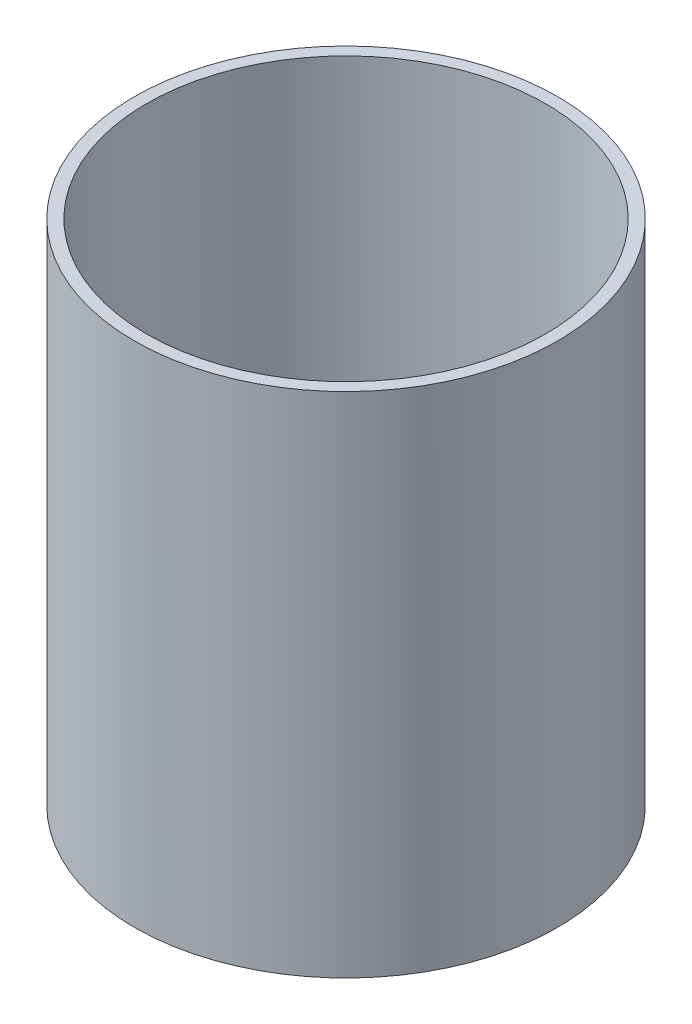
ISO-10303-21;
HEADER;
FILE_DESCRIPTION(('STEP AP214'),'2;1');
FILE_NAME('part.step','',(''),(''),'','','');
FILE_SCHEMA(('AUTOMOTIVE_DESIGN { 1 0 10303 214 1 1 1 1 }'));
ENDSEC;
DATA;
#1=APPLICATION_CONTEXT('core data for automotive mechanical design processes');
#2=APPLICATION_PROTOCOL_DEFINITION('international standard','automotive_design',2000,#1);
#3=PRODUCT_CONTEXT('',#1,'mechanical');
#4=PRODUCT('Part','Part','',(#3));
#5=PRODUCT_RELATED_PRODUCT_CATEGORY('part','',(#4));
#6=PRODUCT_DEFINITION_FORMATION('','',#4);
#7=PRODUCT_DEFINITION_CONTEXT('part definition',#1,'design');
#8=PRODUCT_DEFINITION('design','',#6,#7);
#9=PRODUCT_DEFINITION_SHAPE('','',#8);
#10=(LENGTH_UNIT() NAMED_UNIT(*) SI_UNIT(.MILLI.,.METRE.));
#11=(NAMED_UNIT(*) PLANE_ANGLE_UNIT() SI_UNIT($,.RADIAN.));
#12=(NAMED_UNIT(*) SI_UNIT($,.STERADIAN.) SOLID_ANGLE_UNIT());
#13=UNCERTAINTY_MEASURE_WITH_UNIT(LENGTH_MEASURE(1.E-05),#10,'distance_accuracy_value','');
#14=(GEOMETRIC_REPRESENTATION_CONTEXT(3) GLOBAL_UNCERTAINTY_ASSIGNED_CONTEXT((#13)) GLOBAL_UNIT_ASSIGNED_CONTEXT((#10,
#11,#12)) REPRESENTATION_CONTEXT('',''));
#15=CARTESIAN_POINT('',(0.,0.,0.));
#16=DIRECTION('',(0.,0.,1.));
#17=DIRECTION('',(1.,0.,0.));
#18=AXIS2_PLACEMENT_3D('',#15,#16,#17);
#19=CARTESIAN_POINT('',(0.,50.8,0.));
#20=DIRECTION('',(0.,-1.,0.));
#21=DIRECTION('',(0.,0.,-1.));
#22=AXIS2_PLACEMENT_3D('',#19,#20,#21);
#23=CYLINDRICAL_SURFACE('',#22,17.78);
#24=CARTESIAN_POINT('',(0.,50.8,0.));
#25=DIRECTION('',(0.,1.,0.));
#26=DIRECTION('',(0.,0.,1.));
#27=AXIS2_PLACEMENT_3D('',#24,#25,#26);
#28=CIRCLE('',#27,17.78);
#29=CARTESIAN_POINT('',(0.,50.8,17.78));
#30=VERTEX_POINT('',#29);
#31=EDGE_CURVE('E103',#30,#30,#28,.T.);
#32=ORIENTED_EDGE('',*,*,#31,.F.);
#33=EDGE_LOOP('',(#32));
#34=FACE_BOUND('',#33,.T.);
#35=DIRECTION('',(0.,-1.,0.));
#36=VECTOR('',#35,1.);
#37=CARTESIAN_POINT('',(-17.5976362048998,50.8,2.54));
#38=LINE('',#37,#36);
#39=CARTESIAN_POINT('',(-17.5976362048998,8.128,2.54));
#40=VERTEX_POINT('',#39);
#41=CARTESIAN_POINT('',(-17.5976362048998,0.,2.54));
#42=VERTEX_POINT('',#41);
#43=EDGE_CURVE('E83',#40,#42,#38,.T.);
#44=ORIENTED_EDGE('',*,*,#43,.F.);
#45=CARTESIAN_POINT('',(0.,8.128,0.));
#46=DIRECTION('',(0.,-1.,0.));
#47=DIRECTION('',(0.,0.,-1.));
#48=AXIS2_PLACEMENT_3D('',#45,#46,#47);
#49=CIRCLE('',#48,17.78);
#50=CARTESIAN_POINT('',(-17.5976362048998,8.128,-2.54));
#51=VERTEX_POINT('',#50);
#52=EDGE_CURVE('E118',#51,#40,#49,.T.);
#53=ORIENTED_EDGE('',*,*,#52,.F.);
#54=DIRECTION('',(0.,-1.,0.));
#55=VECTOR('',#54,1.);
#56=CARTESIAN_POINT('',(-17.5976362048998,50.8,-2.54));
#57=LINE('',#56,#55);
#58=CARTESIAN_POINT('',(-17.5976362048998,0.,-2.54));
#59=VERTEX_POINT('',#58);
#60=EDGE_CURVE('E106',#59,#51,#57,.F.);
#61=ORIENTED_EDGE('',*,*,#60,.F.);
#62=CARTESIAN_POINT('',(0.,0.,0.));
#63=DIRECTION('',(0.,1.,0.));
#64=DIRECTION('',(0.,0.,1.));
#65=AXIS2_PLACEMENT_3D('',#62,#63,#64);
#66=CIRCLE('',#65,17.78);
#67=EDGE_CURVE('E98',#59,#42,#66,.T.);
#68=ORIENTED_EDGE('',*,*,#67,.T.);
#69=EDGE_LOOP('',(#44,#53,#61,#68));
#70=FACE_BOUND('',#69,.T.);
#71=ADVANCED_FACE('F39',(#34,#70),#23,.T.);
#72=CARTESIAN_POINT('',(0.,-127.,0.));
#73=DIRECTION('',(0.,1.,0.));
#74=DIRECTION('',(0.,0.,1.));
#75=AXIS2_PLACEMENT_3D('',#72,#73,#74);
#76=CYLINDRICAL_SURFACE('',#75,16.764);
#77=CARTESIAN_POINT('',(0.,50.8,0.));
#78=DIRECTION('',(0.,1.,0.));
#79=DIRECTION('',(0.,0.,1.));
#80=AXIS2_PLACEMENT_3D('',#77,#78,#79);
#81=CIRCLE('',#80,16.764);
#82=CARTESIAN_POINT('',(0.,50.8,16.764));
#83=VERTEX_POINT('',#82);
#84=EDGE_CURVE('E99',#83,#83,#81,.T.);
#85=ORIENTED_EDGE('',*,*,#84,.T.);
#86=EDGE_LOOP('',(#85));
#87=FACE_BOUND('',#86,.T.);
#88=CARTESIAN_POINT('',(0.,8.128,0.));
#89=DIRECTION('',(0.,-1.,0.));
#90=DIRECTION('',(0.,0.,-1.));
#91=AXIS2_PLACEMENT_3D('',#88,#89,#90);
#92=CIRCLE('',#91,16.764);
#93=CARTESIAN_POINT('',(-16.5704585331849,8.128,2.54));
#94=VERTEX_POINT('',#93);
#95=CARTESIAN_POINT('',(-16.5704585331849,8.128,-2.54));
#96=VERTEX_POINT('',#95);
#97=EDGE_CURVE('E54',#94,#96,#92,.F.);
#98=ORIENTED_EDGE('',*,*,#97,.F.);
#99=DIRECTION('',(0.,1.,0.));
#100=VECTOR('',#99,1.);
#101=CARTESIAN_POINT('',(-16.5704585331849,-127.,2.54));
#102=LINE('',#101,#100);
#103=CARTESIAN_POINT('',(-16.5704585331849,0.,2.54));
#104=VERTEX_POINT('',#103);
#105=EDGE_CURVE('E11',#104,#94,#102,.T.);
#106=ORIENTED_EDGE('',*,*,#105,.F.);
#107=CARTESIAN_POINT('',(0.,0.,0.));
#108=DIRECTION('',(0.,1.,0.));
#109=DIRECTION('',(0.,0.,1.));
#110=AXIS2_PLACEMENT_3D('',#107,#108,#109);
#111=CIRCLE('',#110,16.764);
#112=CARTESIAN_POINT('',(-16.5704585331849,0.,-2.54));
#113=VERTEX_POINT('',#112);
#114=EDGE_CURVE('E93',#113,#104,#111,.T.);
#115=ORIENTED_EDGE('',*,*,#114,.F.);
#116=DIRECTION('',(0.,1.,0.));
#117=VECTOR('',#116,1.);
#118=CARTESIAN_POINT('',(-16.5704585331849,-127.,-2.54));
#119=LINE('',#118,#117);
#120=EDGE_CURVE('E47',#96,#113,#119,.F.);
#121=ORIENTED_EDGE('',*,*,#120,.F.);
#122=EDGE_LOOP('',(#98,#106,#115,#121));
#123=FACE_BOUND('',#122,.T.);
#124=ADVANCED_FACE('F92',(#87,#123),#76,.F.);
#125=CARTESIAN_POINT('',(0.,0.,0.));
#126=DIRECTION('',(0.,1.,0.));
#127=DIRECTION('',(0.,0.,1.));
#128=AXIS2_PLACEMENT_3D('',#125,#126,#127);
#129=PLANE('',#128);
#130=DIRECTION('',(-1.,0.,0.));
#131=VECTOR('',#130,1.);
#132=CARTESIAN_POINT('',(17.78,0.,2.54));
#133=LINE('',#132,#131);
#134=EDGE_CURVE('E79',#104,#42,#133,.T.);
#135=ORIENTED_EDGE('',*,*,#134,.T.);
#136=ORIENTED_EDGE('',*,*,#67,.F.);
#137=DIRECTION('',(1.,0.,0.));
#138=VECTOR('',#137,1.);
#139=CARTESIAN_POINT('',(17.78,0.,-2.54));
#140=LINE('',#139,#138);
#141=EDGE_CURVE('E96',#59,#113,#140,.T.);
#142=ORIENTED_EDGE('',*,*,#141,.T.);
#143=ORIENTED_EDGE('',*,*,#114,.T.);
#144=EDGE_LOOP('',(#135,#136,#142,#143));
#145=FACE_BOUND('',#144,.T.);
#146=ADVANCED_FACE('F95',(#145),#129,.F.);
#147=CARTESIAN_POINT('',(0.,50.8,0.));
#148=DIRECTION('',(0.,1.,0.));
#149=DIRECTION('',(0.,0.,1.));
#150=AXIS2_PLACEMENT_3D('',#147,#148,#149);
#151=PLANE('',#150);
#152=ORIENTED_EDGE('',*,*,#84,.F.);
#153=EDGE_LOOP('',(#152));
#154=FACE_BOUND('',#153,.T.);
#155=ORIENTED_EDGE('',*,*,#31,.T.);
#156=EDGE_LOOP('',(#155));
#157=FACE_BOUND('',#156,.T.);
#158=ADVANCED_FACE('F131',(#154,#157),#151,.T.);
#159=CARTESIAN_POINT('',(17.78,8.128,-2.54));
#160=DIRECTION('',(0.,0.,-1.));
#161=DIRECTION('',(-1.,0.,0.));
#162=AXIS2_PLACEMENT_3D('',#159,#160,#161);
#163=PLANE('',#162);
#164=ORIENTED_EDGE('',*,*,#60,.T.);
#165=DIRECTION('',(1.,0.,0.));
#166=VECTOR('',#165,1.);
#167=CARTESIAN_POINT('',(17.78,8.128,-2.54));
#168=LINE('',#167,#166);
#169=EDGE_CURVE('E115',#51,#96,#168,.T.);
#170=ORIENTED_EDGE('',*,*,#169,.T.);
#171=ORIENTED_EDGE('',*,*,#120,.T.);
#172=ORIENTED_EDGE('',*,*,#141,.F.);
#173=EDGE_LOOP('',(#164,#170,#171,#172));
#174=FACE_BOUND('',#173,.T.);
#175=ADVANCED_FACE('F113',(#174),#163,.T.);
#176=CARTESIAN_POINT('',(0.,8.128,-2.54));
#177=DIRECTION('',(0.,-1.,0.));
#178=DIRECTION('',(0.,0.,-1.));
#179=AXIS2_PLACEMENT_3D('',#176,#177,#178);
#180=PLANE('',#179);
#181=ORIENTED_EDGE('',*,*,#97,.T.);
#182=ORIENTED_EDGE('',*,*,#169,.F.);
#183=ORIENTED_EDGE('',*,*,#52,.T.);
#184=DIRECTION('',(-1.,0.,0.));
#185=VECTOR('',#184,1.);
#186=CARTESIAN_POINT('',(17.78,8.128,2.54));
#187=LINE('',#186,#185);
#188=EDGE_CURVE('E89',#94,#40,#187,.T.);
#189=ORIENTED_EDGE('',*,*,#188,.F.);
#190=EDGE_LOOP('',(#181,#182,#183,#189));
#191=FACE_BOUND('',#190,.T.);
#192=ADVANCED_FACE('F138',(#191),#180,.T.);
#193=CARTESIAN_POINT('',(17.78,8.128,2.54));
#194=DIRECTION('',(0.,0.,1.));
#195=DIRECTION('',(1.,0.,0.));
#196=AXIS2_PLACEMENT_3D('',#193,#194,#195);
#197=PLANE('',#196);
#198=ORIENTED_EDGE('',*,*,#43,.T.);
#199=ORIENTED_EDGE('',*,*,#134,.F.);
#200=ORIENTED_EDGE('',*,*,#105,.T.);
#201=ORIENTED_EDGE('',*,*,#188,.T.);
#202=EDGE_LOOP('',(#198,#199,#200,#201));
#203=FACE_BOUND('',#202,.T.);
#204=ADVANCED_FACE('F80',(#203),#197,.T.);
#205=CLOSED_SHELL('',(#71,#124,#146,#158,#175,#192,#204));
#206=MANIFOLD_SOLID_BREP('B2',#205);
#207=ADVANCED_BREP_SHAPE_REPRESENTATION('',(#18,#206),#14);
#208=SHAPE_DEFINITION_REPRESENTATION(#9,#207);
ENDSEC;
END-ISO-10303-21;
